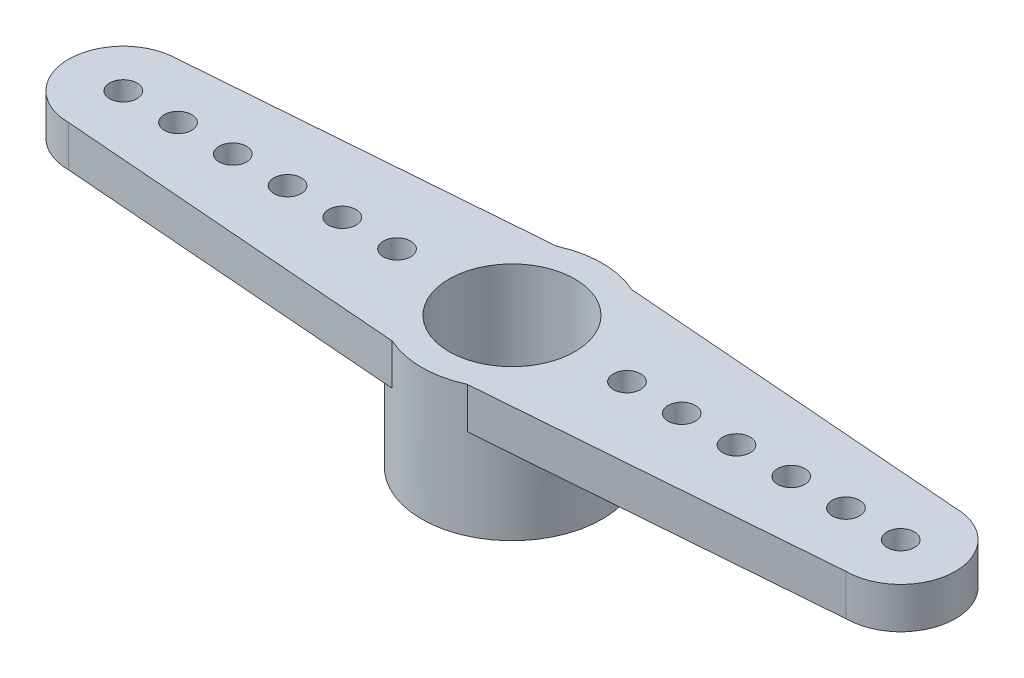
ISO-10303-21;
HEADER;
FILE_DESCRIPTION(('STEP AP214'),'2;1');
FILE_NAME('part.step','',(''),(''),'','','');
FILE_SCHEMA(('AUTOMOTIVE_DESIGN { 1 0 10303 214 1 1 1 1 }'));
ENDSEC;
DATA;
#1=APPLICATION_CONTEXT('core data for automotive mechanical design processes');
#2=APPLICATION_PROTOCOL_DEFINITION('international standard','automotive_design',2000,#1);
#3=PRODUCT_CONTEXT('',#1,'mechanical');
#4=PRODUCT('Part','Part','',(#3));
#5=PRODUCT_RELATED_PRODUCT_CATEGORY('part','',(#4));
#6=PRODUCT_DEFINITION_FORMATION('','',#4);
#7=PRODUCT_DEFINITION_CONTEXT('part definition',#1,'design');
#8=PRODUCT_DEFINITION('design','',#6,#7);
#9=PRODUCT_DEFINITION_SHAPE('','',#8);
#10=(LENGTH_UNIT() NAMED_UNIT(*) SI_UNIT(.MILLI.,.METRE.));
#11=(NAMED_UNIT(*) PLANE_ANGLE_UNIT() SI_UNIT($,.RADIAN.));
#12=(NAMED_UNIT(*) SI_UNIT($,.STERADIAN.) SOLID_ANGLE_UNIT());
#13=UNCERTAINTY_MEASURE_WITH_UNIT(LENGTH_MEASURE(1.E-05),#10,'distance_accuracy_value','');
#14=(GEOMETRIC_REPRESENTATION_CONTEXT(3) GLOBAL_UNCERTAINTY_ASSIGNED_CONTEXT((#13)) GLOBAL_UNIT_ASSIGNED_CONTEXT((#10,
#11,#12)) REPRESENTATION_CONTEXT('',''));
#15=CARTESIAN_POINT('',(0.,0.,0.));
#16=DIRECTION('',(0.,0.,1.));
#17=DIRECTION('',(1.,0.,0.));
#18=AXIS2_PLACEMENT_3D('',#15,#16,#17);
#19=CARTESIAN_POINT('',(0.,4.8,0.));
#20=DIRECTION('',(0.,1.,0.));
#21=DIRECTION('',(0.,0.,1.));
#22=AXIS2_PLACEMENT_3D('',#19,#20,#21);
#23=PLANE('',#22);
#24=CARTESIAN_POINT('',(0.,4.8,0.));
#25=DIRECTION('',(0.,1.,0.));
#26=DIRECTION('',(0.,0.,1.));
#27=AXIS2_PLACEMENT_3D('',#24,#25,#26);
#28=CIRCLE('',#27,3.3);
#29=CARTESIAN_POINT('',(1.37477270848675,4.8,-3.));
#30=VERTEX_POINT('',#29);
#31=CARTESIAN_POINT('',(-1.37477270848675,4.8,-3.));
#32=VERTEX_POINT('',#31);
#33=EDGE_CURVE('E11',#30,#32,#28,.T.);
#34=ORIENTED_EDGE('',*,*,#33,.T.);
#35=DIRECTION('',(-0.996974026427402,0.,0.0777353885250142));
#36=VECTOR('',#35,1.);
#37=CARTESIAN_POINT('',(-0.24080795352108,4.8,-3.08841673751202));
#38=LINE('',#37,#36);
#39=CARTESIAN_POINT('',(-14.2,4.8,-2.));
#40=VERTEX_POINT('',#39);
#41=EDGE_CURVE('E153',#32,#40,#38,.T.);
#42=ORIENTED_EDGE('',*,*,#41,.T.);
#43=CARTESIAN_POINT('',(-14.2,4.8,0.));
#44=DIRECTION('',(0.,1.,0.));
#45=DIRECTION('',(0.,0.,1.));
#46=AXIS2_PLACEMENT_3D('',#43,#44,#45);
#47=CIRCLE('',#46,2.);
#48=CARTESIAN_POINT('',(-14.2,4.8,2.));
#49=VERTEX_POINT('',#48);
#50=EDGE_CURVE('E150',#49,#40,#47,.F.);
#51=ORIENTED_EDGE('',*,*,#50,.F.);
#52=DIRECTION('',(-0.996974026427402,0.,-0.0777353885250141));
#53=VECTOR('',#52,1.);
#54=CARTESIAN_POINT('',(-0.240807953521079,4.8,3.08841673751202));
#55=LINE('',#54,#53);
#56=CARTESIAN_POINT('',(-1.37477270848675,4.8,3.));
#57=VERTEX_POINT('',#56);
#58=EDGE_CURVE('E50',#57,#49,#55,.T.);
#59=ORIENTED_EDGE('',*,*,#58,.F.);
#60=CARTESIAN_POINT('',(1.37477270848675,4.8,3.));
#61=VERTEX_POINT('',#60);
#62=EDGE_CURVE('E43',#57,#61,#28,.T.);
#63=ORIENTED_EDGE('',*,*,#62,.T.);
#64=DIRECTION('',(0.996974026427402,0.,-0.0777353885250141));
#65=VECTOR('',#64,1.);
#66=CARTESIAN_POINT('',(0.240807953521079,4.8,3.08841673751202));
#67=LINE('',#66,#65);
#68=CARTESIAN_POINT('',(14.2,4.8,2.));
#69=VERTEX_POINT('',#68);
#70=EDGE_CURVE('E224',#61,#69,#67,.T.);
#71=ORIENTED_EDGE('',*,*,#70,.T.);
#72=CARTESIAN_POINT('',(14.2,4.8,0.));
#73=DIRECTION('',(0.,1.,0.));
#74=DIRECTION('',(0.,0.,1.));
#75=AXIS2_PLACEMENT_3D('',#72,#73,#74);
#76=CIRCLE('',#75,2.);
#77=CARTESIAN_POINT('',(14.2,4.8,-2.));
#78=VERTEX_POINT('',#77);
#79=EDGE_CURVE('E227',#69,#78,#76,.T.);
#80=ORIENTED_EDGE('',*,*,#79,.T.);
#81=DIRECTION('',(0.996974026427402,0.,0.0777353885250141));
#82=VECTOR('',#81,1.);
#83=CARTESIAN_POINT('',(0.240807953521079,4.8,-3.08841673751202));
#84=LINE('',#83,#82);
#85=EDGE_CURVE('E180',#30,#78,#84,.T.);
#86=ORIENTED_EDGE('',*,*,#85,.F.);
#87=EDGE_LOOP('',(#34,#42,#51,#59,#63,#71,#80,#86));
#88=FACE_BOUND('',#87,.T.);
#89=CARTESIAN_POINT('',(0.,4.8,0.));
#90=DIRECTION('',(0.,1.,0.));
#91=DIRECTION('',(0.,0.,1.));
#92=AXIS2_PLACEMENT_3D('',#89,#90,#91);
#93=CIRCLE('',#92,2.3);
#94=CARTESIAN_POINT('',(0.,4.8,2.3));
#95=VERTEX_POINT('',#94);
#96=EDGE_CURVE('E239',#95,#95,#93,.T.);
#97=ORIENTED_EDGE('',*,*,#96,.F.);
#98=EDGE_LOOP('',(#97));
#99=FACE_BOUND('',#98,.T.);
#100=CARTESIAN_POINT('',(4.2,4.8,0.));
#101=DIRECTION('',(0.,1.,0.));
#102=DIRECTION('',(0.,0.,1.));
#103=AXIS2_PLACEMENT_3D('',#100,#101,#102);
#104=CIRCLE('',#103,0.500000000000001);
#105=CARTESIAN_POINT('',(4.2,4.8,0.500000000000001));
#106=VERTEX_POINT('',#105);
#107=EDGE_CURVE('E171',#106,#106,#104,.T.);
#108=ORIENTED_EDGE('',*,*,#107,.F.);
#109=EDGE_LOOP('',(#108));
#110=FACE_BOUND('',#109,.T.);
#111=CARTESIAN_POINT('',(6.2,4.8,0.));
#112=DIRECTION('',(0.,1.,0.));
#113=DIRECTION('',(0.,0.,1.));
#114=AXIS2_PLACEMENT_3D('',#111,#112,#113);
#115=CIRCLE('',#114,0.500000000000001);
#116=CARTESIAN_POINT('',(6.2,4.8,0.500000000000001));
#117=VERTEX_POINT('',#116);
#118=EDGE_CURVE('E209',#117,#117,#115,.T.);
#119=ORIENTED_EDGE('',*,*,#118,.F.);
#120=EDGE_LOOP('',(#119));
#121=FACE_BOUND('',#120,.T.);
#122=CARTESIAN_POINT('',(8.2,4.8,0.));
#123=DIRECTION('',(0.,1.,0.));
#124=DIRECTION('',(0.,0.,1.));
#125=AXIS2_PLACEMENT_3D('',#122,#123,#124);
#126=CIRCLE('',#125,0.500000000000001);
#127=CARTESIAN_POINT('',(8.2,4.8,0.500000000000001));
#128=VERTEX_POINT('',#127);
#129=EDGE_CURVE('E212',#128,#128,#126,.T.);
#130=ORIENTED_EDGE('',*,*,#129,.F.);
#131=EDGE_LOOP('',(#130));
#132=FACE_BOUND('',#131,.T.);
#133=CARTESIAN_POINT('',(10.2,4.8,0.));
#134=DIRECTION('',(0.,1.,0.));
#135=DIRECTION('',(0.,0.,1.));
#136=AXIS2_PLACEMENT_3D('',#133,#134,#135);
#137=CIRCLE('',#136,0.500000000000001);
#138=CARTESIAN_POINT('',(10.2,4.8,0.500000000000001));
#139=VERTEX_POINT('',#138);
#140=EDGE_CURVE('E215',#139,#139,#137,.T.);
#141=ORIENTED_EDGE('',*,*,#140,.F.);
#142=EDGE_LOOP('',(#141));
#143=FACE_BOUND('',#142,.T.);
#144=CARTESIAN_POINT('',(12.2,4.8,0.));
#145=DIRECTION('',(0.,1.,0.));
#146=DIRECTION('',(0.,0.,1.));
#147=AXIS2_PLACEMENT_3D('',#144,#145,#146);
#148=CIRCLE('',#147,0.500000000000001);
#149=CARTESIAN_POINT('',(12.2,4.8,0.500000000000001));
#150=VERTEX_POINT('',#149);
#151=EDGE_CURVE('E218',#150,#150,#148,.T.);
#152=ORIENTED_EDGE('',*,*,#151,.F.);
#153=EDGE_LOOP('',(#152));
#154=FACE_BOUND('',#153,.T.);
#155=CARTESIAN_POINT('',(14.2,4.8,0.));
#156=DIRECTION('',(0.,1.,0.));
#157=DIRECTION('',(0.,0.,1.));
#158=AXIS2_PLACEMENT_3D('',#155,#156,#157);
#159=CIRCLE('',#158,0.500000000000001);
#160=CARTESIAN_POINT('',(14.2,4.8,0.500000000000001));
#161=VERTEX_POINT('',#160);
#162=EDGE_CURVE('E221',#161,#161,#159,.T.);
#163=ORIENTED_EDGE('',*,*,#162,.F.);
#164=EDGE_LOOP('',(#163));
#165=FACE_BOUND('',#164,.T.);
#166=CARTESIAN_POINT('',(-12.2,4.8,0.));
#167=DIRECTION('',(0.,1.,0.));
#168=DIRECTION('',(0.,0.,1.));
#169=AXIS2_PLACEMENT_3D('',#166,#167,#168);
#170=CIRCLE('',#169,0.500000000000003);
#171=CARTESIAN_POINT('',(-12.2,4.8,0.500000000000003));
#172=VERTEX_POINT('',#171);
#173=EDGE_CURVE('E156',#172,#172,#170,.F.);
#174=ORIENTED_EDGE('',*,*,#173,.T.);
#175=EDGE_LOOP('',(#174));
#176=FACE_BOUND('',#175,.T.);
#177=CARTESIAN_POINT('',(-8.2,4.8,0.));
#178=DIRECTION('',(0.,1.,0.));
#179=DIRECTION('',(0.,0.,1.));
#180=AXIS2_PLACEMENT_3D('',#177,#178,#179);
#181=CIRCLE('',#180,0.499999999999999);
#182=CARTESIAN_POINT('',(-8.2,4.8,0.499999999999999));
#183=VERTEX_POINT('',#182);
#184=EDGE_CURVE('E159',#183,#183,#181,.F.);
#185=ORIENTED_EDGE('',*,*,#184,.T.);
#186=EDGE_LOOP('',(#185));
#187=FACE_BOUND('',#186,.T.);
#188=CARTESIAN_POINT('',(-4.2,4.8,0.));
#189=DIRECTION('',(0.,1.,0.));
#190=DIRECTION('',(0.,0.,1.));
#191=AXIS2_PLACEMENT_3D('',#188,#189,#190);
#192=CIRCLE('',#191,0.500000000000002);
#193=CARTESIAN_POINT('',(-4.2,4.8,0.500000000000002));
#194=VERTEX_POINT('',#193);
#195=EDGE_CURVE('E162',#194,#194,#192,.F.);
#196=ORIENTED_EDGE('',*,*,#195,.T.);
#197=EDGE_LOOP('',(#196));
#198=FACE_BOUND('',#197,.T.);
#199=CARTESIAN_POINT('',(-6.2,4.8,0.));
#200=DIRECTION('',(0.,1.,0.));
#201=DIRECTION('',(0.,0.,1.));
#202=AXIS2_PLACEMENT_3D('',#199,#200,#201);
#203=CIRCLE('',#202,0.500000000000003);
#204=CARTESIAN_POINT('',(-6.2,4.8,0.500000000000003));
#205=VERTEX_POINT('',#204);
#206=EDGE_CURVE('E165',#205,#205,#203,.F.);
#207=ORIENTED_EDGE('',*,*,#206,.T.);
#208=EDGE_LOOP('',(#207));
#209=FACE_BOUND('',#208,.T.);
#210=CARTESIAN_POINT('',(-10.2,4.8,0.));
#211=DIRECTION('',(0.,1.,0.));
#212=DIRECTION('',(0.,0.,1.));
#213=AXIS2_PLACEMENT_3D('',#210,#211,#212);
#214=CIRCLE('',#213,0.499999999999999);
#215=CARTESIAN_POINT('',(-10.2,4.8,0.499999999999999));
#216=VERTEX_POINT('',#215);
#217=EDGE_CURVE('E127',#216,#216,#214,.F.);
#218=ORIENTED_EDGE('',*,*,#217,.T.);
#219=EDGE_LOOP('',(#218));
#220=FACE_BOUND('',#219,.T.);
#221=CARTESIAN_POINT('',(-14.2,4.8,0.));
#222=DIRECTION('',(0.,1.,0.));
#223=DIRECTION('',(0.,0.,1.));
#224=AXIS2_PLACEMENT_3D('',#221,#222,#223);
#225=CIRCLE('',#224,0.500000000000006);
#226=CARTESIAN_POINT('',(-14.2,4.8,0.500000000000006));
#227=VERTEX_POINT('',#226);
#228=EDGE_CURVE('E124',#227,#227,#225,.F.);
#229=ORIENTED_EDGE('',*,*,#228,.T.);
#230=EDGE_LOOP('',(#229));
#231=FACE_BOUND('',#230,.T.);
#232=ADVANCED_FACE('F34',(#88,#99,#110,#121,#132,#143,#154,#165,#176,#187,#198,#209,#220,#231),
#23,.T.);
#233=CARTESIAN_POINT('',(0.,0.,0.));
#234=DIRECTION('',(0.,1.,0.));
#235=DIRECTION('',(0.,0.,1.));
#236=AXIS2_PLACEMENT_3D('',#233,#234,#235);
#237=PLANE('',#236);
#238=CARTESIAN_POINT('',(0.,0.,0.));
#239=DIRECTION('',(0.,1.,0.));
#240=DIRECTION('',(0.,0.,1.));
#241=AXIS2_PLACEMENT_3D('',#238,#239,#240);
#242=CIRCLE('',#241,3.3);
#243=CARTESIAN_POINT('',(0.,0.,3.3));
#244=VERTEX_POINT('',#243);
#245=EDGE_CURVE('E38',#244,#244,#242,.T.);
#246=ORIENTED_EDGE('',*,*,#245,.F.);
#247=EDGE_LOOP('',(#246));
#248=FACE_BOUND('',#247,.T.);
#249=CARTESIAN_POINT('',(0.,0.,0.));
#250=DIRECTION('',(0.,1.,0.));
#251=DIRECTION('',(0.,0.,1.));
#252=AXIS2_PLACEMENT_3D('',#249,#250,#251);
#253=CIRCLE('',#252,2.3);
#254=CARTESIAN_POINT('',(0.,0.,2.3));
#255=VERTEX_POINT('',#254);
#256=EDGE_CURVE('E234',#255,#255,#253,.T.);
#257=ORIENTED_EDGE('',*,*,#256,.T.);
#258=EDGE_LOOP('',(#257));
#259=FACE_BOUND('',#258,.T.);
#260=ADVANCED_FACE('F245',(#248,#259),#237,.F.);
#261=CARTESIAN_POINT('',(0.,4.8,0.));
#262=DIRECTION('',(0.,-1.,0.));
#263=DIRECTION('',(0.,0.,-1.));
#264=AXIS2_PLACEMENT_3D('',#261,#262,#263);
#265=CYLINDRICAL_SURFACE('',#264,3.3);
#266=CARTESIAN_POINT('',(0.,3.3,0.));
#267=DIRECTION('',(0.,1.,0.));
#268=DIRECTION('',(0.,0.,1.));
#269=AXIS2_PLACEMENT_3D('',#266,#267,#268);
#270=CIRCLE('',#269,3.3);
#271=CARTESIAN_POINT('',(-1.37477270848675,3.3,-3.));
#272=VERTEX_POINT('',#271);
#273=CARTESIAN_POINT('',(-1.37477270848675,3.3,3.));
#274=VERTEX_POINT('',#273);
#275=EDGE_CURVE('E109',#272,#274,#270,.T.);
#276=ORIENTED_EDGE('',*,*,#275,.F.);
#277=DIRECTION('',(0.,1.,0.));
#278=VECTOR('',#277,1.);
#279=CARTESIAN_POINT('',(-1.37477270848675,3.3,-3.));
#280=LINE('',#279,#278);
#281=EDGE_CURVE('E172',#272,#32,#280,.T.);
#282=ORIENTED_EDGE('',*,*,#281,.T.);
#283=ORIENTED_EDGE('',*,*,#33,.F.);
#284=DIRECTION('',(0.,1.,0.));
#285=VECTOR('',#284,1.);
#286=CARTESIAN_POINT('',(1.37477270848675,3.3,-3.));
#287=LINE('',#286,#285);
#288=CARTESIAN_POINT('',(1.37477270848675,3.3,-3.));
#289=VERTEX_POINT('',#288);
#290=EDGE_CURVE('E58',#289,#30,#287,.T.);
#291=ORIENTED_EDGE('',*,*,#290,.F.);
#292=CARTESIAN_POINT('',(0.,3.3,0.));
#293=DIRECTION('',(0.,1.,0.));
#294=DIRECTION('',(0.,0.,1.));
#295=AXIS2_PLACEMENT_3D('',#292,#293,#294);
#296=CIRCLE('',#295,3.3);
#297=CARTESIAN_POINT('',(1.37477270848675,3.3,3.));
#298=VERTEX_POINT('',#297);
#299=EDGE_CURVE('E203',#298,#289,#296,.T.);
#300=ORIENTED_EDGE('',*,*,#299,.F.);
#301=DIRECTION('',(0.,1.,0.));
#302=VECTOR('',#301,1.);
#303=CARTESIAN_POINT('',(1.37477270848675,3.3,3.));
#304=LINE('',#303,#302);
#305=EDGE_CURVE('E231',#298,#61,#304,.T.);
#306=ORIENTED_EDGE('',*,*,#305,.T.);
#307=ORIENTED_EDGE('',*,*,#62,.F.);
#308=DIRECTION('',(0.,1.,0.));
#309=VECTOR('',#308,1.);
#310=CARTESIAN_POINT('',(-1.37477270848675,3.3,3.));
#311=LINE('',#310,#309);
#312=EDGE_CURVE('E118',#274,#57,#311,.T.);
#313=ORIENTED_EDGE('',*,*,#312,.F.);
#314=EDGE_LOOP('',(#276,#282,#283,#291,#300,#306,#307,#313));
#315=FACE_BOUND('',#314,.T.);
#316=ORIENTED_EDGE('',*,*,#245,.T.);
#317=EDGE_LOOP('',(#316));
#318=FACE_BOUND('',#317,.T.);
#319=ADVANCED_FACE('F36',(#315,#318),#265,.T.);
#320=CARTESIAN_POINT('',(0.,4.8,0.));
#321=DIRECTION('',(0.,-1.,0.));
#322=DIRECTION('',(0.,0.,-1.));
#323=AXIS2_PLACEMENT_3D('',#320,#321,#322);
#324=CYLINDRICAL_SURFACE('',#323,2.3);
#325=ORIENTED_EDGE('',*,*,#96,.T.);
#326=EDGE_LOOP('',(#325));
#327=FACE_BOUND('',#326,.T.);
#328=ORIENTED_EDGE('',*,*,#256,.F.);
#329=EDGE_LOOP('',(#328));
#330=FACE_BOUND('',#329,.T.);
#331=ADVANCED_FACE('F247',(#327,#330),#324,.F.);
#332=CARTESIAN_POINT('',(0.240807953521079,3.3,3.08841673751202));
#333=DIRECTION('',(0.0777353885250141,0.,0.996974026427401));
#334=DIRECTION('',(0.996974026427402,0.,-0.0777353885250141));
#335=AXIS2_PLACEMENT_3D('',#332,#333,#334);
#336=PLANE('',#335);
#337=ORIENTED_EDGE('',*,*,#70,.F.);
#338=ORIENTED_EDGE('',*,*,#305,.F.);
#339=DIRECTION('',(0.996974026427402,0.,-0.0777353885250141));
#340=VECTOR('',#339,1.);
#341=CARTESIAN_POINT('',(0.240807953521079,3.3,3.08841673751202));
#342=LINE('',#341,#340);
#343=CARTESIAN_POINT('',(14.2,3.3,2.));
#344=VERTEX_POINT('',#343);
#345=EDGE_CURVE('E195',#298,#344,#342,.T.);
#346=ORIENTED_EDGE('',*,*,#345,.T.);
#347=DIRECTION('',(0.,1.,0.));
#348=VECTOR('',#347,1.);
#349=CARTESIAN_POINT('',(14.2,3.3,2.));
#350=LINE('',#349,#348);
#351=EDGE_CURVE('E206',#344,#69,#350,.T.);
#352=ORIENTED_EDGE('',*,*,#351,.T.);
#353=EDGE_LOOP('',(#337,#338,#346,#352));
#354=FACE_BOUND('',#353,.T.);
#355=ADVANCED_FACE('F249',(#354),#336,.T.);
#356=CARTESIAN_POINT('',(0.240807953521079,3.3,-3.08841673751202));
#357=DIRECTION('',(-0.0777353885250141,0.,0.996974026427401));
#358=DIRECTION('',(0.996974026427402,0.,0.0777353885250141));
#359=AXIS2_PLACEMENT_3D('',#356,#357,#358);
#360=PLANE('',#359);
#361=ORIENTED_EDGE('',*,*,#85,.T.);
#362=DIRECTION('',(0.,1.,0.));
#363=VECTOR('',#362,1.);
#364=CARTESIAN_POINT('',(14.2,3.3,-2.));
#365=LINE('',#364,#363);
#366=CARTESIAN_POINT('',(14.2,3.3,-2.));
#367=VERTEX_POINT('',#366);
#368=EDGE_CURVE('E236',#367,#78,#365,.T.);
#369=ORIENTED_EDGE('',*,*,#368,.F.);
#370=DIRECTION('',(0.996974026427402,0.,0.0777353885250141));
#371=VECTOR('',#370,1.);
#372=CARTESIAN_POINT('',(0.240807953521079,3.3,-3.08841673751202));
#373=LINE('',#372,#371);
#374=EDGE_CURVE('E201',#289,#367,#373,.T.);
#375=ORIENTED_EDGE('',*,*,#374,.F.);
#376=ORIENTED_EDGE('',*,*,#290,.T.);
#377=EDGE_LOOP('',(#361,#369,#375,#376));
#378=FACE_BOUND('',#377,.T.);
#379=ADVANCED_FACE('F256',(#378),#360,.F.);
#380=CARTESIAN_POINT('',(14.2,3.3,0.));
#381=DIRECTION('',(0.,1.,0.));
#382=DIRECTION('',(0.,0.,1.));
#383=AXIS2_PLACEMENT_3D('',#380,#381,#382);
#384=CYLINDRICAL_SURFACE('',#383,0.500000000000001);
#385=CARTESIAN_POINT('',(14.2,3.3,0.));
#386=DIRECTION('',(0.,1.,0.));
#387=DIRECTION('',(0.,0.,1.));
#388=AXIS2_PLACEMENT_3D('',#385,#386,#387);
#389=CIRCLE('',#388,0.500000000000001);
#390=CARTESIAN_POINT('',(14.2,3.3,0.500000000000001));
#391=VERTEX_POINT('',#390);
#392=EDGE_CURVE('E192',#391,#391,#389,.T.);
#393=ORIENTED_EDGE('',*,*,#392,.F.);
#394=EDGE_LOOP('',(#393));
#395=FACE_BOUND('',#394,.T.);
#396=ORIENTED_EDGE('',*,*,#162,.T.);
#397=EDGE_LOOP('',(#396));
#398=FACE_BOUND('',#397,.T.);
#399=ADVANCED_FACE('F339',(#395,#398),#384,.F.);
#400=CARTESIAN_POINT('',(12.2,3.3,0.));
#401=DIRECTION('',(0.,1.,0.));
#402=DIRECTION('',(0.,0.,1.));
#403=AXIS2_PLACEMENT_3D('',#400,#401,#402);
#404=CYLINDRICAL_SURFACE('',#403,0.500000000000001);
#405=CARTESIAN_POINT('',(12.2,3.3,0.));
#406=DIRECTION('',(0.,1.,0.));
#407=DIRECTION('',(0.,0.,1.));
#408=AXIS2_PLACEMENT_3D('',#405,#406,#407);
#409=CIRCLE('',#408,0.500000000000001);
#410=CARTESIAN_POINT('',(12.2,3.3,0.500000000000001));
#411=VERTEX_POINT('',#410);
#412=EDGE_CURVE('E189',#411,#411,#409,.T.);
#413=ORIENTED_EDGE('',*,*,#412,.F.);
#414=EDGE_LOOP('',(#413));
#415=FACE_BOUND('',#414,.T.);
#416=ORIENTED_EDGE('',*,*,#151,.T.);
#417=EDGE_LOOP('',(#416));
#418=FACE_BOUND('',#417,.T.);
#419=ADVANCED_FACE('F346',(#415,#418),#404,.F.);
#420=CARTESIAN_POINT('',(10.2,3.3,0.));
#421=DIRECTION('',(0.,1.,0.));
#422=DIRECTION('',(0.,0.,1.));
#423=AXIS2_PLACEMENT_3D('',#420,#421,#422);
#424=CYLINDRICAL_SURFACE('',#423,0.500000000000001);
#425=CARTESIAN_POINT('',(10.2,3.3,0.));
#426=DIRECTION('',(0.,1.,0.));
#427=DIRECTION('',(0.,0.,1.));
#428=AXIS2_PLACEMENT_3D('',#425,#426,#427);
#429=CIRCLE('',#428,0.500000000000001);
#430=CARTESIAN_POINT('',(10.2,3.3,0.500000000000001));
#431=VERTEX_POINT('',#430);
#432=EDGE_CURVE('E186',#431,#431,#429,.T.);
#433=ORIENTED_EDGE('',*,*,#432,.F.);
#434=EDGE_LOOP('',(#433));
#435=FACE_BOUND('',#434,.T.);
#436=ORIENTED_EDGE('',*,*,#140,.T.);
#437=EDGE_LOOP('',(#436));
#438=FACE_BOUND('',#437,.T.);
#439=ADVANCED_FACE('F350',(#435,#438),#424,.F.);
#440=CARTESIAN_POINT('',(8.2,3.3,0.));
#441=DIRECTION('',(0.,1.,0.));
#442=DIRECTION('',(0.,0.,1.));
#443=AXIS2_PLACEMENT_3D('',#440,#441,#442);
#444=CYLINDRICAL_SURFACE('',#443,0.500000000000001);
#445=CARTESIAN_POINT('',(8.2,3.3,0.));
#446=DIRECTION('',(0.,1.,0.));
#447=DIRECTION('',(0.,0.,1.));
#448=AXIS2_PLACEMENT_3D('',#445,#446,#447);
#449=CIRCLE('',#448,0.500000000000001);
#450=CARTESIAN_POINT('',(8.2,3.3,0.500000000000001));
#451=VERTEX_POINT('',#450);
#452=EDGE_CURVE('E183',#451,#451,#449,.T.);
#453=ORIENTED_EDGE('',*,*,#452,.F.);
#454=EDGE_LOOP('',(#453));
#455=FACE_BOUND('',#454,.T.);
#456=ORIENTED_EDGE('',*,*,#129,.T.);
#457=EDGE_LOOP('',(#456));
#458=FACE_BOUND('',#457,.T.);
#459=ADVANCED_FACE('F354',(#455,#458),#444,.F.);
#460=CARTESIAN_POINT('',(6.2,3.3,0.));
#461=DIRECTION('',(0.,1.,0.));
#462=DIRECTION('',(0.,0.,1.));
#463=AXIS2_PLACEMENT_3D('',#460,#461,#462);
#464=CYLINDRICAL_SURFACE('',#463,0.500000000000001);
#465=CARTESIAN_POINT('',(6.2,3.3,0.));
#466=DIRECTION('',(0.,1.,0.));
#467=DIRECTION('',(0.,0.,1.));
#468=AXIS2_PLACEMENT_3D('',#465,#466,#467);
#469=CIRCLE('',#468,0.500000000000001);
#470=CARTESIAN_POINT('',(6.2,3.3,0.500000000000001));
#471=VERTEX_POINT('',#470);
#472=EDGE_CURVE('E179',#471,#471,#469,.T.);
#473=ORIENTED_EDGE('',*,*,#472,.F.);
#474=EDGE_LOOP('',(#473));
#475=FACE_BOUND('',#474,.T.);
#476=ORIENTED_EDGE('',*,*,#118,.T.);
#477=EDGE_LOOP('',(#476));
#478=FACE_BOUND('',#477,.T.);
#479=ADVANCED_FACE('F358',(#475,#478),#464,.F.);
#480=CARTESIAN_POINT('',(4.2,3.3,0.));
#481=DIRECTION('',(0.,1.,0.));
#482=DIRECTION('',(0.,0.,1.));
#483=AXIS2_PLACEMENT_3D('',#480,#481,#482);
#484=CYLINDRICAL_SURFACE('',#483,0.500000000000001);
#485=CARTESIAN_POINT('',(4.2,3.3,0.));
#486=DIRECTION('',(0.,1.,0.));
#487=DIRECTION('',(0.,0.,1.));
#488=AXIS2_PLACEMENT_3D('',#485,#486,#487);
#489=CIRCLE('',#488,0.500000000000001);
#490=CARTESIAN_POINT('',(4.2,3.3,0.500000000000001));
#491=VERTEX_POINT('',#490);
#492=EDGE_CURVE('E176',#491,#491,#489,.T.);
#493=ORIENTED_EDGE('',*,*,#492,.F.);
#494=EDGE_LOOP('',(#493));
#495=FACE_BOUND('',#494,.T.);
#496=ORIENTED_EDGE('',*,*,#107,.T.);
#497=EDGE_LOOP('',(#496));
#498=FACE_BOUND('',#497,.T.);
#499=ADVANCED_FACE('F341',(#495,#498),#484,.F.);
#500=CARTESIAN_POINT('',(14.2,3.3,0.));
#501=DIRECTION('',(0.,1.,0.));
#502=DIRECTION('',(0.,0.,1.));
#503=AXIS2_PLACEMENT_3D('',#500,#501,#502);
#504=CYLINDRICAL_SURFACE('',#503,2.);
#505=ORIENTED_EDGE('',*,*,#79,.F.);
#506=ORIENTED_EDGE('',*,*,#351,.F.);
#507=CARTESIAN_POINT('',(14.2,3.3,0.));
#508=DIRECTION('',(0.,1.,0.));
#509=DIRECTION('',(0.,0.,1.));
#510=AXIS2_PLACEMENT_3D('',#507,#508,#509);
#511=CIRCLE('',#510,2.);
#512=EDGE_CURVE('E198',#344,#367,#511,.T.);
#513=ORIENTED_EDGE('',*,*,#512,.T.);
#514=ORIENTED_EDGE('',*,*,#368,.T.);
#515=EDGE_LOOP('',(#505,#506,#513,#514));
#516=FACE_BOUND('',#515,.T.);
#517=ADVANCED_FACE('F335',(#516),#504,.T.);
#518=CARTESIAN_POINT('',(0.,3.3,0.));
#519=DIRECTION('',(0.,1.,0.));
#520=DIRECTION('',(0.,0.,1.));
#521=AXIS2_PLACEMENT_3D('',#518,#519,#520);
#522=PLANE('',#521);
#523=ORIENTED_EDGE('',*,*,#492,.T.);
#524=EDGE_LOOP('',(#523));
#525=FACE_BOUND('',#524,.T.);
#526=ORIENTED_EDGE('',*,*,#472,.T.);
#527=EDGE_LOOP('',(#526));
#528=FACE_BOUND('',#527,.T.);
#529=ORIENTED_EDGE('',*,*,#452,.T.);
#530=EDGE_LOOP('',(#529));
#531=FACE_BOUND('',#530,.T.);
#532=ORIENTED_EDGE('',*,*,#432,.T.);
#533=EDGE_LOOP('',(#532));
#534=FACE_BOUND('',#533,.T.);
#535=ORIENTED_EDGE('',*,*,#412,.T.);
#536=EDGE_LOOP('',(#535));
#537=FACE_BOUND('',#536,.T.);
#538=ORIENTED_EDGE('',*,*,#392,.T.);
#539=EDGE_LOOP('',(#538));
#540=FACE_BOUND('',#539,.T.);
#541=ORIENTED_EDGE('',*,*,#345,.F.);
#542=ORIENTED_EDGE('',*,*,#299,.T.);
#543=ORIENTED_EDGE('',*,*,#374,.T.);
#544=ORIENTED_EDGE('',*,*,#512,.F.);
#545=EDGE_LOOP('',(#541,#542,#543,#544));
#546=FACE_BOUND('',#545,.T.);
#547=ADVANCED_FACE('F332',(#525,#528,#531,#534,#537,#540,#546),#522,.F.);
#548=CARTESIAN_POINT('',(-14.2,3.3,0.));
#549=DIRECTION('',(0.,1.,0.));
#550=DIRECTION('',(0.,0.,1.));
#551=AXIS2_PLACEMENT_3D('',#548,#549,#550);
#552=CYLINDRICAL_SURFACE('',#551,2.);
#553=ORIENTED_EDGE('',*,*,#50,.T.);
#554=DIRECTION('',(0.,1.,0.));
#555=VECTOR('',#554,1.);
#556=CARTESIAN_POINT('',(-14.2,3.3,-2.));
#557=LINE('',#556,#555);
#558=CARTESIAN_POINT('',(-14.2,3.3,-2.));
#559=VERTEX_POINT('',#558);
#560=EDGE_CURVE('E122',#559,#40,#557,.T.);
#561=ORIENTED_EDGE('',*,*,#560,.F.);
#562=CARTESIAN_POINT('',(-14.2,3.3,0.));
#563=DIRECTION('',(0.,1.,0.));
#564=DIRECTION('',(0.,0.,1.));
#565=AXIS2_PLACEMENT_3D('',#562,#563,#564);
#566=CIRCLE('',#565,2.);
#567=CARTESIAN_POINT('',(-14.2,3.3,2.));
#568=VERTEX_POINT('',#567);
#569=EDGE_CURVE('E106',#568,#559,#566,.F.);
#570=ORIENTED_EDGE('',*,*,#569,.F.);
#571=DIRECTION('',(0.,1.,0.));
#572=VECTOR('',#571,1.);
#573=CARTESIAN_POINT('',(-14.2,3.3,2.));
#574=LINE('',#573,#572);
#575=EDGE_CURVE('E114',#568,#49,#574,.T.);
#576=ORIENTED_EDGE('',*,*,#575,.T.);
#577=EDGE_LOOP('',(#553,#561,#570,#576));
#578=FACE_BOUND('',#577,.T.);
#579=ADVANCED_FACE('F121',(#578),#552,.T.);
#580=CARTESIAN_POINT('',(-0.24080795352108,3.3,-3.08841673751202));
#581=DIRECTION('',(-0.0777353885250142,0.,-0.996974026427401));
#582=DIRECTION('',(-0.996974026427402,0.,0.0777353885250142));
#583=AXIS2_PLACEMENT_3D('',#580,#581,#582);
#584=PLANE('',#583);
#585=ORIENTED_EDGE('',*,*,#41,.F.);
#586=ORIENTED_EDGE('',*,*,#281,.F.);
#587=DIRECTION('',(-0.996974026427402,0.,0.0777353885250142));
#588=VECTOR('',#587,1.);
#589=CARTESIAN_POINT('',(-0.24080795352108,3.3,-3.08841673751202));
#590=LINE('',#589,#588);
#591=EDGE_CURVE('E131',#272,#559,#590,.T.);
#592=ORIENTED_EDGE('',*,*,#591,.T.);
#593=ORIENTED_EDGE('',*,*,#560,.T.);
#594=EDGE_LOOP('',(#585,#586,#592,#593));
#595=FACE_BOUND('',#594,.T.);
#596=ADVANCED_FACE('F311',(#595),#584,.T.);
#597=CARTESIAN_POINT('',(-10.2,3.3,0.));
#598=DIRECTION('',(0.,1.,0.));
#599=DIRECTION('',(0.,0.,1.));
#600=AXIS2_PLACEMENT_3D('',#597,#598,#599);
#601=CYLINDRICAL_SURFACE('',#600,0.499999999999999);
#602=CARTESIAN_POINT('',(-10.2,3.3,0.));
#603=DIRECTION('',(0.,1.,0.));
#604=DIRECTION('',(0.,0.,1.));
#605=AXIS2_PLACEMENT_3D('',#602,#603,#604);
#606=CIRCLE('',#605,0.499999999999999);
#607=CARTESIAN_POINT('',(-10.2,3.3,0.499999999999999));
#608=VERTEX_POINT('',#607);
#609=EDGE_CURVE('E145',#608,#608,#606,.F.);
#610=ORIENTED_EDGE('',*,*,#609,.T.);
#611=EDGE_LOOP('',(#610));
#612=FACE_BOUND('',#611,.T.);
#613=ORIENTED_EDGE('',*,*,#217,.F.);
#614=EDGE_LOOP('',(#613));
#615=FACE_BOUND('',#614,.T.);
#616=ADVANCED_FACE('F307',(#612,#615),#601,.F.);
#617=CARTESIAN_POINT('',(-6.2,3.3,0.));
#618=DIRECTION('',(0.,1.,0.));
#619=DIRECTION('',(0.,0.,1.));
#620=AXIS2_PLACEMENT_3D('',#617,#618,#619);
#621=CYLINDRICAL_SURFACE('',#620,0.500000000000003);
#622=CARTESIAN_POINT('',(-6.2,3.3,0.));
#623=DIRECTION('',(0.,1.,0.));
#624=DIRECTION('',(0.,0.,1.));
#625=AXIS2_PLACEMENT_3D('',#622,#623,#624);
#626=CIRCLE('',#625,0.500000000000003);
#627=CARTESIAN_POINT('',(-6.2,3.3,0.500000000000003));
#628=VERTEX_POINT('',#627);
#629=EDGE_CURVE('E142',#628,#628,#626,.F.);
#630=ORIENTED_EDGE('',*,*,#629,.T.);
#631=EDGE_LOOP('',(#630));
#632=FACE_BOUND('',#631,.T.);
#633=ORIENTED_EDGE('',*,*,#206,.F.);
#634=EDGE_LOOP('',(#633));
#635=FACE_BOUND('',#634,.T.);
#636=ADVANCED_FACE('F310',(#632,#635),#621,.F.);
#637=CARTESIAN_POINT('',(-4.2,3.3,0.));
#638=DIRECTION('',(0.,1.,0.));
#639=DIRECTION('',(0.,0.,1.));
#640=AXIS2_PLACEMENT_3D('',#637,#638,#639);
#641=CYLINDRICAL_SURFACE('',#640,0.500000000000002);
#642=CARTESIAN_POINT('',(-4.2,3.3,0.));
#643=DIRECTION('',(0.,1.,0.));
#644=DIRECTION('',(0.,0.,1.));
#645=AXIS2_PLACEMENT_3D('',#642,#643,#644);
#646=CIRCLE('',#645,0.500000000000002);
#647=CARTESIAN_POINT('',(-4.2,3.3,0.500000000000002));
#648=VERTEX_POINT('',#647);
#649=EDGE_CURVE('E139',#648,#648,#646,.F.);
#650=ORIENTED_EDGE('',*,*,#649,.T.);
#651=EDGE_LOOP('',(#650));
#652=FACE_BOUND('',#651,.T.);
#653=ORIENTED_EDGE('',*,*,#195,.F.);
#654=EDGE_LOOP('',(#653));
#655=FACE_BOUND('',#654,.T.);
#656=ADVANCED_FACE('F315',(#652,#655),#641,.F.);
#657=CARTESIAN_POINT('',(-8.2,3.3,0.));
#658=DIRECTION('',(0.,1.,0.));
#659=DIRECTION('',(0.,0.,1.));
#660=AXIS2_PLACEMENT_3D('',#657,#658,#659);
#661=CYLINDRICAL_SURFACE('',#660,0.499999999999999);
#662=CARTESIAN_POINT('',(-8.2,3.3,0.));
#663=DIRECTION('',(0.,1.,0.));
#664=DIRECTION('',(0.,0.,1.));
#665=AXIS2_PLACEMENT_3D('',#662,#663,#664);
#666=CIRCLE('',#665,0.499999999999999);
#667=CARTESIAN_POINT('',(-8.2,3.3,0.499999999999999));
#668=VERTEX_POINT('',#667);
#669=EDGE_CURVE('E136',#668,#668,#666,.F.);
#670=ORIENTED_EDGE('',*,*,#669,.T.);
#671=EDGE_LOOP('',(#670));
#672=FACE_BOUND('',#671,.T.);
#673=ORIENTED_EDGE('',*,*,#184,.F.);
#674=EDGE_LOOP('',(#673));
#675=FACE_BOUND('',#674,.T.);
#676=ADVANCED_FACE('F319',(#672,#675),#661,.F.);
#677=CARTESIAN_POINT('',(-12.2,3.3,0.));
#678=DIRECTION('',(0.,1.,0.));
#679=DIRECTION('',(0.,0.,1.));
#680=AXIS2_PLACEMENT_3D('',#677,#678,#679);
#681=CYLINDRICAL_SURFACE('',#680,0.500000000000003);
#682=CARTESIAN_POINT('',(-12.2,3.3,0.));
#683=DIRECTION('',(0.,1.,0.));
#684=DIRECTION('',(0.,0.,1.));
#685=AXIS2_PLACEMENT_3D('',#682,#683,#684);
#686=CIRCLE('',#685,0.500000000000003);
#687=CARTESIAN_POINT('',(-12.2,3.3,0.500000000000003));
#688=VERTEX_POINT('',#687);
#689=EDGE_CURVE('E133',#688,#688,#686,.F.);
#690=ORIENTED_EDGE('',*,*,#689,.T.);
#691=EDGE_LOOP('',(#690));
#692=FACE_BOUND('',#691,.T.);
#693=ORIENTED_EDGE('',*,*,#173,.F.);
#694=EDGE_LOOP('',(#693));
#695=FACE_BOUND('',#694,.T.);
#696=ADVANCED_FACE('F304',(#692,#695),#681,.F.);
#697=CARTESIAN_POINT('',(-0.240807953521079,3.3,3.08841673751202));
#698=DIRECTION('',(0.0777353885250141,0.,-0.996974026427401));
#699=DIRECTION('',(-0.996974026427402,0.,-0.0777353885250141));
#700=AXIS2_PLACEMENT_3D('',#697,#698,#699);
#701=PLANE('',#700);
#702=ORIENTED_EDGE('',*,*,#58,.T.);
#703=ORIENTED_EDGE('',*,*,#575,.F.);
#704=DIRECTION('',(-0.996974026427402,0.,-0.0777353885250141));
#705=VECTOR('',#704,1.);
#706=CARTESIAN_POINT('',(-0.240807953521079,3.3,3.08841673751202));
#707=LINE('',#706,#705);
#708=EDGE_CURVE('E100',#274,#568,#707,.T.);
#709=ORIENTED_EDGE('',*,*,#708,.F.);
#710=ORIENTED_EDGE('',*,*,#312,.T.);
#711=EDGE_LOOP('',(#702,#703,#709,#710));
#712=FACE_BOUND('',#711,.T.);
#713=ADVANCED_FACE('F115',(#712),#701,.F.);
#714=CARTESIAN_POINT('',(-14.2,3.3,0.));
#715=DIRECTION('',(0.,1.,0.));
#716=DIRECTION('',(0.,0.,1.));
#717=AXIS2_PLACEMENT_3D('',#714,#715,#716);
#718=CYLINDRICAL_SURFACE('',#717,0.500000000000006);
#719=CARTESIAN_POINT('',(-14.2,3.3,0.));
#720=DIRECTION('',(0.,1.,0.));
#721=DIRECTION('',(0.,0.,1.));
#722=AXIS2_PLACEMENT_3D('',#719,#720,#721);
#723=CIRCLE('',#722,0.500000000000006);
#724=CARTESIAN_POINT('',(-14.2,3.3,0.500000000000006));
#725=VERTEX_POINT('',#724);
#726=EDGE_CURVE('E119',#725,#725,#723,.F.);
#727=ORIENTED_EDGE('',*,*,#726,.T.);
#728=EDGE_LOOP('',(#727));
#729=FACE_BOUND('',#728,.T.);
#730=ORIENTED_EDGE('',*,*,#228,.F.);
#731=EDGE_LOOP('',(#730));
#732=FACE_BOUND('',#731,.T.);
#733=ADVANCED_FACE('F295',(#729,#732),#718,.F.);
#734=CARTESIAN_POINT('',(0.,3.3,0.));
#735=DIRECTION('',(0.,1.,0.));
#736=DIRECTION('',(0.,0.,1.));
#737=AXIS2_PLACEMENT_3D('',#734,#735,#736);
#738=PLANE('',#737);
#739=ORIENTED_EDGE('',*,*,#569,.T.);
#740=ORIENTED_EDGE('',*,*,#591,.F.);
#741=ORIENTED_EDGE('',*,*,#275,.T.);
#742=ORIENTED_EDGE('',*,*,#708,.T.);
#743=EDGE_LOOP('',(#739,#740,#741,#742));
#744=FACE_BOUND('',#743,.T.);
#745=ORIENTED_EDGE('',*,*,#689,.F.);
#746=EDGE_LOOP('',(#745));
#747=FACE_BOUND('',#746,.T.);
#748=ORIENTED_EDGE('',*,*,#669,.F.);
#749=EDGE_LOOP('',(#748));
#750=FACE_BOUND('',#749,.T.);
#751=ORIENTED_EDGE('',*,*,#649,.F.);
#752=EDGE_LOOP('',(#751));
#753=FACE_BOUND('',#752,.T.);
#754=ORIENTED_EDGE('',*,*,#629,.F.);
#755=EDGE_LOOP('',(#754));
#756=FACE_BOUND('',#755,.T.);
#757=ORIENTED_EDGE('',*,*,#609,.F.);
#758=EDGE_LOOP('',(#757));
#759=FACE_BOUND('',#758,.T.);
#760=ORIENTED_EDGE('',*,*,#726,.F.);
#761=EDGE_LOOP('',(#760));
#762=FACE_BOUND('',#761,.T.);
#763=ADVANCED_FACE('F102',(#744,#747,#750,#753,#756,#759,#762),#738,.F.);
#764=CLOSED_SHELL('',(#232,#260,#319,#331,#355,#379,#399,#419,#439,#459,#479,#499,#517,#547,
#579,#596,#616,#636,#656,#676,#696,#713,#733,#763));
#765=MANIFOLD_SOLID_BREP('B2',#764);
#766=ADVANCED_BREP_SHAPE_REPRESENTATION('',(#18,#765),#14);
#767=SHAPE_DEFINITION_REPRESENTATION(#9,#766);
ENDSEC;
END-ISO-10303-21;
